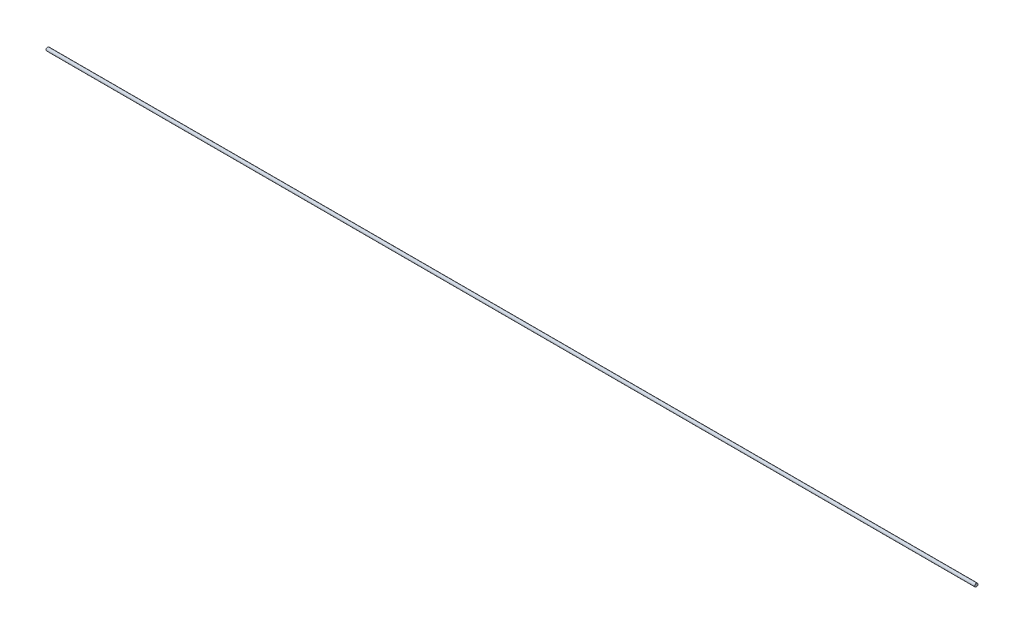
ISO-10303-21;
HEADER;
FILE_DESCRIPTION(('STEP AP214'),'2;1');
FILE_NAME('part.step','',(''),(''),'','','');
FILE_SCHEMA(('AUTOMOTIVE_DESIGN { 1 0 10303 214 1 1 1 1 }'));
ENDSEC;
DATA;
#1=APPLICATION_CONTEXT('core data for automotive mechanical design processes');
#2=APPLICATION_PROTOCOL_DEFINITION('international standard','automotive_design',2000,#1);
#3=PRODUCT_CONTEXT('',#1,'mechanical');
#4=PRODUCT('Part','Part','',(#3));
#5=PRODUCT_RELATED_PRODUCT_CATEGORY('part','',(#4));
#6=PRODUCT_DEFINITION_FORMATION('','',#4);
#7=PRODUCT_DEFINITION_CONTEXT('part definition',#1,'design');
#8=PRODUCT_DEFINITION('design','',#6,#7);
#9=PRODUCT_DEFINITION_SHAPE('','',#8);
#10=(LENGTH_UNIT() NAMED_UNIT(*) SI_UNIT(.MILLI.,.METRE.));
#11=(NAMED_UNIT(*) PLANE_ANGLE_UNIT() SI_UNIT($,.RADIAN.));
#12=(NAMED_UNIT(*) SI_UNIT($,.STERADIAN.) SOLID_ANGLE_UNIT());
#13=UNCERTAINTY_MEASURE_WITH_UNIT(LENGTH_MEASURE(1.E-05),#10,'distance_accuracy_value','');
#14=(GEOMETRIC_REPRESENTATION_CONTEXT(3) GLOBAL_UNCERTAINTY_ASSIGNED_CONTEXT((#13)) GLOBAL_UNIT_ASSIGNED_CONTEXT((#10,
#11,#12)) REPRESENTATION_CONTEXT('',''));
#15=CARTESIAN_POINT('',(0.,0.,0.));
#16=DIRECTION('',(0.,0.,1.));
#17=DIRECTION('',(1.,0.,0.));
#18=AXIS2_PLACEMENT_3D('',#15,#16,#17);
#19=CARTESIAN_POINT('',(578.749999978,0.,0.));
#20=DIRECTION('',(-1.,0.,0.));
#21=DIRECTION('',(0.,0.,1.));
#22=AXIS2_PLACEMENT_3D('',#19,#20,#21);
#23=CYLINDRICAL_SURFACE('',#22,1.0287);
#24=CARTESIAN_POINT('',(578.749999978,0.,0.));
#25=DIRECTION('',(1.,0.,0.));
#26=DIRECTION('',(0.,0.,-1.));
#27=AXIS2_PLACEMENT_3D('',#24,#25,#26);
#28=CIRCLE('',#27,1.0287);
#29=CARTESIAN_POINT('',(578.749999978,0.,-1.0287));
#30=VERTEX_POINT('',#29);
#31=EDGE_CURVE('E12',#30,#30,#28,.T.);
#32=ORIENTED_EDGE('',*,*,#31,.F.);
#33=EDGE_LOOP('',(#32));
#34=FACE_BOUND('',#33,.T.);
#35=CARTESIAN_POINT('',(0.,0.,0.));
#36=DIRECTION('',(1.,0.,0.));
#37=DIRECTION('',(0.,0.,-1.));
#38=AXIS2_PLACEMENT_3D('',#35,#36,#37);
#39=CIRCLE('',#38,1.0287);
#40=CARTESIAN_POINT('',(0.,0.,-1.0287));
#41=VERTEX_POINT('',#40);
#42=EDGE_CURVE('E44',#41,#41,#39,.T.);
#43=ORIENTED_EDGE('',*,*,#42,.T.);
#44=EDGE_LOOP('',(#43));
#45=FACE_BOUND('',#44,.T.);
#46=ADVANCED_FACE('F41',(#34,#45),#23,.T.);
#47=CARTESIAN_POINT('',(578.749999978,0.,0.));
#48=DIRECTION('',(1.,0.,0.));
#49=DIRECTION('',(0.,0.,-1.));
#50=AXIS2_PLACEMENT_3D('',#47,#48,#49);
#51=PLANE('',#50);
#52=ORIENTED_EDGE('',*,*,#31,.T.);
#53=EDGE_LOOP('',(#52));
#54=FACE_BOUND('',#53,.T.);
#55=ADVANCED_FACE('F56',(#54),#51,.T.);
#56=CARTESIAN_POINT('',(0.,0.,0.));
#57=DIRECTION('',(1.,0.,0.));
#58=DIRECTION('',(0.,0.,-1.));
#59=AXIS2_PLACEMENT_3D('',#56,#57,#58);
#60=PLANE('',#59);
#61=ORIENTED_EDGE('',*,*,#42,.F.);
#62=EDGE_LOOP('',(#61));
#63=FACE_BOUND('',#62,.T.);
#64=ADVANCED_FACE('F54',(#63),#60,.F.);
#65=CLOSED_SHELL('',(#46,#55,#64));
#66=MANIFOLD_SOLID_BREP('B2',#65);
#67=ADVANCED_BREP_SHAPE_REPRESENTATION('',(#18,#66),#14);
#68=SHAPE_DEFINITION_REPRESENTATION(#9,#67);
ENDSEC;
END-ISO-10303-21;
